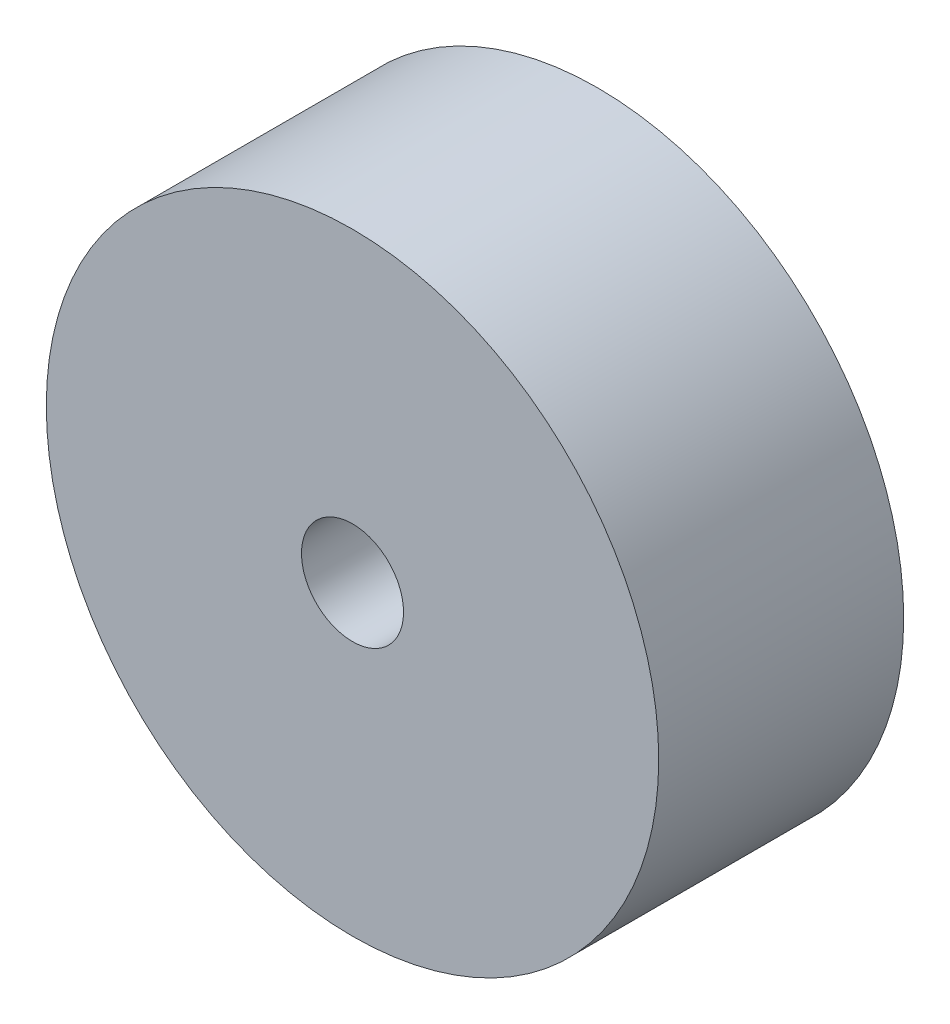
ISO-10303-21;
HEADER;
FILE_DESCRIPTION(('STEP AP214'),'2;1');
FILE_NAME('part.step','',(''),(''),'','','');
FILE_SCHEMA(('AUTOMOTIVE_DESIGN { 1 0 10303 214 1 1 1 1 }'));
ENDSEC;
DATA;
#1=APPLICATION_CONTEXT('core data for automotive mechanical design processes');
#2=APPLICATION_PROTOCOL_DEFINITION('international standard','automotive_design',2000,#1);
#3=PRODUCT_CONTEXT('',#1,'mechanical');
#4=PRODUCT('Part','Part','',(#3));
#5=PRODUCT_RELATED_PRODUCT_CATEGORY('part','',(#4));
#6=PRODUCT_DEFINITION_FORMATION('','',#4);
#7=PRODUCT_DEFINITION_CONTEXT('part definition',#1,'design');
#8=PRODUCT_DEFINITION('design','',#6,#7);
#9=PRODUCT_DEFINITION_SHAPE('','',#8);
#10=(LENGTH_UNIT() NAMED_UNIT(*) SI_UNIT(.MILLI.,.METRE.));
#11=(NAMED_UNIT(*) PLANE_ANGLE_UNIT() SI_UNIT($,.RADIAN.));
#12=(NAMED_UNIT(*) SI_UNIT($,.STERADIAN.) SOLID_ANGLE_UNIT());
#13=UNCERTAINTY_MEASURE_WITH_UNIT(LENGTH_MEASURE(1.E-05),#10,'distance_accuracy_value','');
#14=(GEOMETRIC_REPRESENTATION_CONTEXT(3) GLOBAL_UNCERTAINTY_ASSIGNED_CONTEXT((#13)) GLOBAL_UNIT_ASSIGNED_CONTEXT((#10,
#11,#12)) REPRESENTATION_CONTEXT('',''));
#15=CARTESIAN_POINT('',(0.,0.,0.));
#16=DIRECTION('',(0.,0.,1.));
#17=DIRECTION('',(1.,0.,0.));
#18=AXIS2_PLACEMENT_3D('',#15,#16,#17);
#19=CARTESIAN_POINT('',(-13.9028833057808,4.64519847288133,6.));
#20=DIRECTION('',(0.,0.,1.));
#21=DIRECTION('',(1.,0.,0.));
#22=AXIS2_PLACEMENT_3D('',#19,#20,#21);
#23=PLANE('',#22);
#24=CARTESIAN_POINT('',(-13.9028833057808,4.64519847288133,6.));
#25=DIRECTION('',(0.,0.,1.));
#26=DIRECTION('',(1.,0.,0.));
#27=AXIS2_PLACEMENT_3D('',#24,#25,#26);
#28=CIRCLE('',#27,7.5);
#29=CARTESIAN_POINT('',(-6.40288330578081,4.64519847288133,6.));
#30=VERTEX_POINT('',#29);
#31=EDGE_CURVE('E10',#30,#30,#28,.T.);
#32=ORIENTED_EDGE('',*,*,#31,.T.);
#33=EDGE_LOOP('',(#32));
#34=FACE_BOUND('',#33,.T.);
#35=CARTESIAN_POINT('',(-13.9028833057808,4.64519847288133,6.));
#36=DIRECTION('',(0.,0.,1.));
#37=DIRECTION('',(1.,0.,0.));
#38=AXIS2_PLACEMENT_3D('',#35,#36,#37);
#39=CIRCLE('',#38,1.25);
#40=CARTESIAN_POINT('',(-12.6528833057808,4.64519847288133,6.));
#41=VERTEX_POINT('',#40);
#42=EDGE_CURVE('E41',#41,#41,#39,.T.);
#43=ORIENTED_EDGE('',*,*,#42,.F.);
#44=EDGE_LOOP('',(#43));
#45=FACE_BOUND('',#44,.T.);
#46=ADVANCED_FACE('F30',(#34,#45),#23,.T.);
#47=CARTESIAN_POINT('',(-13.9028833057808,4.64519847288133,0.));
#48=DIRECTION('',(0.,0.,1.));
#49=DIRECTION('',(1.,0.,0.));
#50=AXIS2_PLACEMENT_3D('',#47,#48,#49);
#51=PLANE('',#50);
#52=CARTESIAN_POINT('',(-13.9028833057808,4.64519847288133,0.));
#53=DIRECTION('',(0.,0.,1.));
#54=DIRECTION('',(1.,0.,0.));
#55=AXIS2_PLACEMENT_3D('',#52,#53,#54);
#56=CIRCLE('',#55,7.5);
#57=CARTESIAN_POINT('',(-6.40288330578081,4.64519847288133,0.));
#58=VERTEX_POINT('',#57);
#59=EDGE_CURVE('E34',#58,#58,#56,.T.);
#60=ORIENTED_EDGE('',*,*,#59,.F.);
#61=EDGE_LOOP('',(#60));
#62=FACE_BOUND('',#61,.T.);
#63=CARTESIAN_POINT('',(-13.9028833057808,4.64519847288133,0.));
#64=DIRECTION('',(0.,0.,1.));
#65=DIRECTION('',(1.,0.,0.));
#66=AXIS2_PLACEMENT_3D('',#63,#64,#65);
#67=CIRCLE('',#66,1.25);
#68=CARTESIAN_POINT('',(-12.6528833057808,4.64519847288133,0.));
#69=VERTEX_POINT('',#68);
#70=EDGE_CURVE('E43',#69,#69,#67,.T.);
#71=ORIENTED_EDGE('',*,*,#70,.T.);
#72=EDGE_LOOP('',(#71));
#73=FACE_BOUND('',#72,.T.);
#74=ADVANCED_FACE('F53',(#62,#73),#51,.F.);
#75=CARTESIAN_POINT('',(-13.9028833057808,4.64519847288133,6.));
#76=DIRECTION('',(0.,0.,-1.));
#77=DIRECTION('',(-1.,0.,0.));
#78=AXIS2_PLACEMENT_3D('',#75,#76,#77);
#79=CYLINDRICAL_SURFACE('',#78,7.5);
#80=ORIENTED_EDGE('',*,*,#31,.F.);
#81=EDGE_LOOP('',(#80));
#82=FACE_BOUND('',#81,.T.);
#83=ORIENTED_EDGE('',*,*,#59,.T.);
#84=EDGE_LOOP('',(#83));
#85=FACE_BOUND('',#84,.T.);
#86=ADVANCED_FACE('F32',(#82,#85),#79,.T.);
#87=CARTESIAN_POINT('',(-13.9028833057808,4.64519847288133,6.));
#88=DIRECTION('',(0.,0.,-1.));
#89=DIRECTION('',(-1.,0.,0.));
#90=AXIS2_PLACEMENT_3D('',#87,#88,#89);
#91=CYLINDRICAL_SURFACE('',#90,1.25);
#92=ORIENTED_EDGE('',*,*,#42,.T.);
#93=EDGE_LOOP('',(#92));
#94=FACE_BOUND('',#93,.T.);
#95=ORIENTED_EDGE('',*,*,#70,.F.);
#96=EDGE_LOOP('',(#95));
#97=FACE_BOUND('',#96,.T.);
#98=ADVANCED_FACE('F49',(#94,#97),#91,.F.);
#99=CLOSED_SHELL('',(#46,#74,#86,#98));
#100=MANIFOLD_SOLID_BREP('B2',#99);
#101=ADVANCED_BREP_SHAPE_REPRESENTATION('',(#18,#100),#14);
#102=SHAPE_DEFINITION_REPRESENTATION(#9,#101);
ENDSEC;
END-ISO-10303-21;
